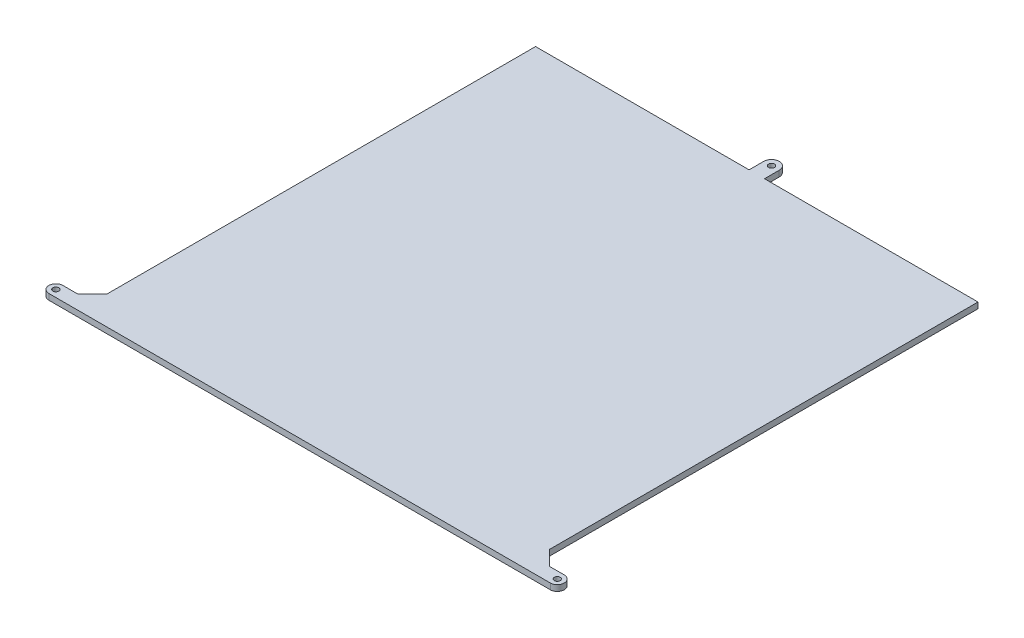
ISO-10303-21;
HEADER;
FILE_DESCRIPTION(('STEP AP214'),'2;1');
FILE_NAME('part.step','',(''),(''),'','','');
FILE_SCHEMA(('AUTOMOTIVE_DESIGN { 1 0 10303 214 1 1 1 1 }'));
ENDSEC;
DATA;
#1=APPLICATION_CONTEXT('core data for automotive mechanical design processes');
#2=APPLICATION_PROTOCOL_DEFINITION('international standard','automotive_design',2000,#1);
#3=PRODUCT_CONTEXT('',#1,'mechanical');
#4=PRODUCT('Part','Part','',(#3));
#5=PRODUCT_RELATED_PRODUCT_CATEGORY('part','',(#4));
#6=PRODUCT_DEFINITION_FORMATION('','',#4);
#7=PRODUCT_DEFINITION_CONTEXT('part definition',#1,'design');
#8=PRODUCT_DEFINITION('design','',#6,#7);
#9=PRODUCT_DEFINITION_SHAPE('','',#8);
#10=(LENGTH_UNIT() NAMED_UNIT(*) SI_UNIT(.MILLI.,.METRE.));
#11=(NAMED_UNIT(*) PLANE_ANGLE_UNIT() SI_UNIT($,.RADIAN.));
#12=(NAMED_UNIT(*) SI_UNIT($,.STERADIAN.) SOLID_ANGLE_UNIT());
#13=UNCERTAINTY_MEASURE_WITH_UNIT(LENGTH_MEASURE(1.E-05),#10,'distance_accuracy_value','');
#14=(GEOMETRIC_REPRESENTATION_CONTEXT(3) GLOBAL_UNCERTAINTY_ASSIGNED_CONTEXT((#13)) GLOBAL_UNIT_ASSIGNED_CONTEXT((#10,
#11,#12)) REPRESENTATION_CONTEXT('',''));
#15=CARTESIAN_POINT('',(0.,0.,0.));
#16=DIRECTION('',(0.,0.,1.));
#17=DIRECTION('',(1.,0.,0.));
#18=AXIS2_PLACEMENT_3D('',#15,#16,#17);
#19=CARTESIAN_POINT('',(0.,4.,-160.));
#20=DIRECTION('',(0.,-1.,0.));
#21=DIRECTION('',(0.,0.,-1.));
#22=AXIS2_PLACEMENT_3D('',#19,#20,#21);
#23=CYLINDRICAL_SURFACE('',#22,5.22079231391709);
#24=CARTESIAN_POINT('',(0.,0.,-160.));
#25=DIRECTION('',(0.,1.,0.));
#26=DIRECTION('',(0.,0.,1.));
#27=AXIS2_PLACEMENT_3D('',#24,#25,#26);
#28=CIRCLE('',#27,5.22079231391709);
#29=CARTESIAN_POINT('',(-5.22079231391714,0.,-160.));
#30=VERTEX_POINT('',#29);
#31=CARTESIAN_POINT('',(5.22079231391703,0.,-160.));
#32=VERTEX_POINT('',#31);
#33=EDGE_CURVE('E176',#30,#32,#28,.F.);
#34=ORIENTED_EDGE('',*,*,#33,.F.);
#35=DIRECTION('',(0.,-1.,0.));
#36=VECTOR('',#35,1.);
#37=CARTESIAN_POINT('',(-5.22079231391714,4.,-160.));
#38=LINE('',#37,#36);
#39=CARTESIAN_POINT('',(-5.22079231391714,4.,-160.));
#40=VERTEX_POINT('',#39);
#41=EDGE_CURVE('E11',#40,#30,#38,.T.);
#42=ORIENTED_EDGE('',*,*,#41,.F.);
#43=CARTESIAN_POINT('',(0.,4.,-160.));
#44=DIRECTION('',(0.,1.,0.));
#45=DIRECTION('',(0.,0.,1.));
#46=AXIS2_PLACEMENT_3D('',#43,#44,#45);
#47=CIRCLE('',#46,5.22079231391709);
#48=CARTESIAN_POINT('',(5.22079231391703,4.,-160.));
#49=VERTEX_POINT('',#48);
#50=EDGE_CURVE('E219',#40,#49,#47,.F.);
#51=ORIENTED_EDGE('',*,*,#50,.T.);
#52=DIRECTION('',(0.,-1.,0.));
#53=VECTOR('',#52,1.);
#54=CARTESIAN_POINT('',(5.22079231391703,4.,-160.));
#55=LINE('',#54,#53);
#56=EDGE_CURVE('E53',#49,#32,#55,.T.);
#57=ORIENTED_EDGE('',*,*,#56,.T.);
#58=EDGE_LOOP('',(#34,#42,#51,#57));
#59=FACE_BOUND('',#58,.T.);
#60=ADVANCED_FACE('F37',(#59),#23,.T.);
#61=CARTESIAN_POINT('',(-5.22079231391714,4.,0.));
#62=DIRECTION('',(1.,0.,0.));
#63=DIRECTION('',(0.,0.,-1.));
#64=AXIS2_PLACEMENT_3D('',#61,#62,#63);
#65=PLANE('',#64);
#66=DIRECTION('',(0.,0.,1.));
#67=VECTOR('',#66,1.);
#68=CARTESIAN_POINT('',(-5.22079231391714,0.,0.));
#69=LINE('',#68,#67);
#70=CARTESIAN_POINT('',(-5.22079231391714,0.,-150.));
#71=VERTEX_POINT('',#70);
#72=EDGE_CURVE('E178',#30,#71,#69,.T.);
#73=ORIENTED_EDGE('',*,*,#72,.T.);
#74=DIRECTION('',(0.,-1.,0.));
#75=VECTOR('',#74,1.);
#76=CARTESIAN_POINT('',(-5.22079231391714,4.,-150.));
#77=LINE('',#76,#75);
#78=CARTESIAN_POINT('',(-5.22079231391714,4.,-150.));
#79=VERTEX_POINT('',#78);
#80=EDGE_CURVE('E45',#79,#71,#77,.T.);
#81=ORIENTED_EDGE('',*,*,#80,.F.);
#82=DIRECTION('',(0.,0.,1.));
#83=VECTOR('',#82,1.);
#84=CARTESIAN_POINT('',(-5.22079231391714,4.,0.));
#85=LINE('',#84,#83);
#86=EDGE_CURVE('E266',#40,#79,#85,.T.);
#87=ORIENTED_EDGE('',*,*,#86,.F.);
#88=ORIENTED_EDGE('',*,*,#41,.T.);
#89=EDGE_LOOP('',(#73,#81,#87,#88));
#90=FACE_BOUND('',#89,.T.);
#91=ADVANCED_FACE('F251',(#90),#65,.F.);
#92=CARTESIAN_POINT('',(0.,4.,-150.));
#93=DIRECTION('',(0.,0.,-1.));
#94=DIRECTION('',(-1.,0.,0.));
#95=AXIS2_PLACEMENT_3D('',#92,#93,#94);
#96=PLANE('',#95);
#97=DIRECTION('',(1.,0.,0.));
#98=VECTOR('',#97,1.);
#99=CARTESIAN_POINT('',(0.,0.,-150.));
#100=LINE('',#99,#98);
#101=CARTESIAN_POINT('',(-150.,0.,-150.));
#102=VERTEX_POINT('',#101);
#103=EDGE_CURVE('E181',#102,#71,#100,.T.);
#104=ORIENTED_EDGE('',*,*,#103,.F.);
#105=DIRECTION('',(0.,-1.,0.));
#106=VECTOR('',#105,1.);
#107=CARTESIAN_POINT('',(-150.,4.,-150.));
#108=LINE('',#107,#106);
#109=CARTESIAN_POINT('',(-150.,4.,-150.));
#110=VERTEX_POINT('',#109);
#111=EDGE_CURVE('E241',#110,#102,#108,.T.);
#112=ORIENTED_EDGE('',*,*,#111,.F.);
#113=DIRECTION('',(1.,0.,0.));
#114=VECTOR('',#113,1.);
#115=CARTESIAN_POINT('',(0.,4.,-150.));
#116=LINE('',#115,#114);
#117=EDGE_CURVE('E248',#110,#79,#116,.T.);
#118=ORIENTED_EDGE('',*,*,#117,.T.);
#119=ORIENTED_EDGE('',*,*,#80,.T.);
#120=EDGE_LOOP('',(#104,#112,#118,#119));
#121=FACE_BOUND('',#120,.T.);
#122=ADVANCED_FACE('F246',(#121),#96,.T.);
#123=CARTESIAN_POINT('',(-150.,4.,0.));
#124=DIRECTION('',(1.,0.,0.));
#125=DIRECTION('',(0.,0.,-1.));
#126=AXIS2_PLACEMENT_3D('',#123,#124,#125);
#127=PLANE('',#126);
#128=DIRECTION('',(0.,0.,1.));
#129=VECTOR('',#128,1.);
#130=CARTESIAN_POINT('',(-150.,0.,0.));
#131=LINE('',#130,#129);
#132=CARTESIAN_POINT('',(-150.,0.,140.527151097649));
#133=VERTEX_POINT('',#132);
#134=EDGE_CURVE('E184',#102,#133,#131,.T.);
#135=ORIENTED_EDGE('',*,*,#134,.T.);
#136=DIRECTION('',(0.,-1.,0.));
#137=VECTOR('',#136,1.);
#138=CARTESIAN_POINT('',(-150.,4.,140.527151097649));
#139=LINE('',#138,#137);
#140=CARTESIAN_POINT('',(-150.,4.,140.527151097649));
#141=VERTEX_POINT('',#140);
#142=EDGE_CURVE('E239',#141,#133,#139,.T.);
#143=ORIENTED_EDGE('',*,*,#142,.F.);
#144=DIRECTION('',(0.,0.,1.));
#145=VECTOR('',#144,1.);
#146=CARTESIAN_POINT('',(-150.,4.,0.));
#147=LINE('',#146,#145);
#148=EDGE_CURVE('E262',#110,#141,#147,.T.);
#149=ORIENTED_EDGE('',*,*,#148,.F.);
#150=ORIENTED_EDGE('',*,*,#111,.T.);
#151=EDGE_LOOP('',(#135,#143,#149,#150));
#152=FACE_BOUND('',#151,.T.);
#153=ADVANCED_FACE('F259',(#152),#127,.F.);
#154=CARTESIAN_POINT('',(-4.73642445117548,4.,-4.73642445117548));
#155=DIRECTION('',(-0.707106781186547,0.,-0.707106781186547));
#156=DIRECTION('',(-0.707106781186548,0.,0.707106781186548));
#157=AXIS2_PLACEMENT_3D('',#154,#155,#156);
#158=PLANE('',#157);
#159=DIRECTION('',(0.707106781186548,0.,-0.707106781186548));
#160=VECTOR('',#159,1.);
#161=CARTESIAN_POINT('',(-4.73642445117548,0.,-4.73642445117548));
#162=LINE('',#161,#160);
#163=CARTESIAN_POINT('',(-160.,0.,150.527151097649));
#164=VERTEX_POINT('',#163);
#165=EDGE_CURVE('E187',#164,#133,#162,.T.);
#166=ORIENTED_EDGE('',*,*,#165,.F.);
#167=DIRECTION('',(0.,-1.,0.));
#168=VECTOR('',#167,1.);
#169=CARTESIAN_POINT('',(-160.,4.,150.527151097649));
#170=LINE('',#169,#168);
#171=CARTESIAN_POINT('',(-160.,4.,150.527151097649));
#172=VERTEX_POINT('',#171);
#173=EDGE_CURVE('E237',#172,#164,#170,.T.);
#174=ORIENTED_EDGE('',*,*,#173,.F.);
#175=DIRECTION('',(0.707106781186548,0.,-0.707106781186548));
#176=VECTOR('',#175,1.);
#177=CARTESIAN_POINT('',(-4.73642445117548,4.,-4.73642445117548));
#178=LINE('',#177,#176);
#179=EDGE_CURVE('E264',#172,#141,#178,.T.);
#180=ORIENTED_EDGE('',*,*,#179,.T.);
#181=ORIENTED_EDGE('',*,*,#142,.T.);
#182=EDGE_LOOP('',(#166,#174,#180,#181));
#183=FACE_BOUND('',#182,.T.);
#184=ADVANCED_FACE('F318',(#183),#158,.T.);
#185=CARTESIAN_POINT('',(0.,4.,150.527151097649));
#186=DIRECTION('',(0.,0.,-1.));
#187=DIRECTION('',(-1.,0.,0.));
#188=AXIS2_PLACEMENT_3D('',#185,#186,#187);
#189=PLANE('',#188);
#190=DIRECTION('',(1.,0.,0.));
#191=VECTOR('',#190,1.);
#192=CARTESIAN_POINT('',(0.,0.,150.527151097649));
#193=LINE('',#192,#191);
#194=CARTESIAN_POINT('',(-170.,0.,150.527151097649));
#195=VERTEX_POINT('',#194);
#196=EDGE_CURVE('E190',#195,#164,#193,.T.);
#197=ORIENTED_EDGE('',*,*,#196,.F.);
#198=DIRECTION('',(0.,-1.,0.));
#199=VECTOR('',#198,1.);
#200=CARTESIAN_POINT('',(-170.,4.,150.527151097649));
#201=LINE('',#200,#199);
#202=CARTESIAN_POINT('',(-170.,4.,150.527151097649));
#203=VERTEX_POINT('',#202);
#204=EDGE_CURVE('E235',#203,#195,#201,.T.);
#205=ORIENTED_EDGE('',*,*,#204,.F.);
#206=DIRECTION('',(1.,0.,0.));
#207=VECTOR('',#206,1.);
#208=CARTESIAN_POINT('',(0.,4.,150.527151097649));
#209=LINE('',#208,#207);
#210=EDGE_CURVE('E272',#203,#172,#209,.T.);
#211=ORIENTED_EDGE('',*,*,#210,.T.);
#212=ORIENTED_EDGE('',*,*,#173,.T.);
#213=EDGE_LOOP('',(#197,#205,#211,#212));
#214=FACE_BOUND('',#213,.T.);
#215=ADVANCED_FACE('F321',(#214),#189,.T.);
#216=CARTESIAN_POINT('',(-170.,4.,155.263575548825));
#217=DIRECTION('',(0.,-1.,0.));
#218=DIRECTION('',(0.,0.,-1.));
#219=AXIS2_PLACEMENT_3D('',#216,#217,#218);
#220=CYLINDRICAL_SURFACE('',#219,4.73642445117553);
#221=CARTESIAN_POINT('',(-170.,0.,155.263575548825));
#222=DIRECTION('',(0.,1.,0.));
#223=DIRECTION('',(0.,0.,1.));
#224=AXIS2_PLACEMENT_3D('',#221,#222,#223);
#225=CIRCLE('',#224,4.73642445117553);
#226=CARTESIAN_POINT('',(-170.,0.,160.));
#227=VERTEX_POINT('',#226);
#228=EDGE_CURVE('E193',#195,#227,#225,.T.);
#229=ORIENTED_EDGE('',*,*,#228,.T.);
#230=DIRECTION('',(0.,-1.,0.));
#231=VECTOR('',#230,1.);
#232=CARTESIAN_POINT('',(-170.,4.,160.));
#233=LINE('',#232,#231);
#234=CARTESIAN_POINT('',(-170.,4.,160.));
#235=VERTEX_POINT('',#234);
#236=EDGE_CURVE('E232',#235,#227,#233,.T.);
#237=ORIENTED_EDGE('',*,*,#236,.F.);
#238=CARTESIAN_POINT('',(-170.,4.,155.263575548825));
#239=DIRECTION('',(0.,1.,0.));
#240=DIRECTION('',(0.,0.,1.));
#241=AXIS2_PLACEMENT_3D('',#238,#239,#240);
#242=CIRCLE('',#241,4.73642445117553);
#243=EDGE_CURVE('E275',#203,#235,#242,.T.);
#244=ORIENTED_EDGE('',*,*,#243,.F.);
#245=ORIENTED_EDGE('',*,*,#204,.T.);
#246=EDGE_LOOP('',(#229,#237,#244,#245));
#247=FACE_BOUND('',#246,.T.);
#248=ADVANCED_FACE('F325',(#247),#220,.T.);
#249=CARTESIAN_POINT('',(0.,4.,160.));
#250=DIRECTION('',(0.,0.,-1.));
#251=DIRECTION('',(-1.,0.,0.));
#252=AXIS2_PLACEMENT_3D('',#249,#250,#251);
#253=PLANE('',#252);
#254=DIRECTION('',(1.,0.,0.));
#255=VECTOR('',#254,1.);
#256=CARTESIAN_POINT('',(0.,0.,160.));
#257=LINE('',#256,#255);
#258=CARTESIAN_POINT('',(170.,0.,160.));
#259=VERTEX_POINT('',#258);
#260=EDGE_CURVE('E195',#227,#259,#257,.T.);
#261=ORIENTED_EDGE('',*,*,#260,.T.);
#262=DIRECTION('',(0.,-1.,0.));
#263=VECTOR('',#262,1.);
#264=CARTESIAN_POINT('',(170.,4.,160.));
#265=LINE('',#264,#263);
#266=CARTESIAN_POINT('',(170.,4.,160.));
#267=VERTEX_POINT('',#266);
#268=EDGE_CURVE('E229',#267,#259,#265,.T.);
#269=ORIENTED_EDGE('',*,*,#268,.F.);
#270=DIRECTION('',(1.,0.,0.));
#271=VECTOR('',#270,1.);
#272=CARTESIAN_POINT('',(0.,4.,160.));
#273=LINE('',#272,#271);
#274=EDGE_CURVE('E277',#235,#267,#273,.T.);
#275=ORIENTED_EDGE('',*,*,#274,.F.);
#276=ORIENTED_EDGE('',*,*,#236,.T.);
#277=EDGE_LOOP('',(#261,#269,#275,#276));
#278=FACE_BOUND('',#277,.T.);
#279=ADVANCED_FACE('F329',(#278),#253,.F.);
#280=CARTESIAN_POINT('',(170.,4.,155.263575548825));
#281=DIRECTION('',(0.,-1.,0.));
#282=DIRECTION('',(0.,0.,-1.));
#283=AXIS2_PLACEMENT_3D('',#280,#281,#282);
#284=CYLINDRICAL_SURFACE('',#283,4.73642445117554);
#285=CARTESIAN_POINT('',(170.,0.,155.263575548825));
#286=DIRECTION('',(0.,1.,0.));
#287=DIRECTION('',(0.,0.,1.));
#288=AXIS2_PLACEMENT_3D('',#285,#286,#287);
#289=CIRCLE('',#288,4.73642445117554);
#290=CARTESIAN_POINT('',(170.,0.,150.527151097649));
#291=VERTEX_POINT('',#290);
#292=EDGE_CURVE('E197',#259,#291,#289,.T.);
#293=ORIENTED_EDGE('',*,*,#292,.T.);
#294=DIRECTION('',(0.,-1.,0.));
#295=VECTOR('',#294,1.);
#296=CARTESIAN_POINT('',(170.,4.,150.527151097649));
#297=LINE('',#296,#295);
#298=CARTESIAN_POINT('',(170.,4.,150.527151097649));
#299=VERTEX_POINT('',#298);
#300=EDGE_CURVE('E226',#299,#291,#297,.T.);
#301=ORIENTED_EDGE('',*,*,#300,.F.);
#302=CARTESIAN_POINT('',(170.,4.,155.263575548825));
#303=DIRECTION('',(0.,1.,0.));
#304=DIRECTION('',(0.,0.,1.));
#305=AXIS2_PLACEMENT_3D('',#302,#303,#304);
#306=CIRCLE('',#305,4.73642445117554);
#307=EDGE_CURVE('E279',#267,#299,#306,.T.);
#308=ORIENTED_EDGE('',*,*,#307,.F.);
#309=ORIENTED_EDGE('',*,*,#268,.T.);
#310=EDGE_LOOP('',(#293,#301,#308,#309));
#311=FACE_BOUND('',#310,.T.);
#312=ADVANCED_FACE('F333',(#311),#284,.T.);
#313=CARTESIAN_POINT('',(4.177967724496E-13,4.,150.527151097649));
#314=DIRECTION('',(0.,0.,1.));
#315=DIRECTION('',(1.,0.,0.));
#316=AXIS2_PLACEMENT_3D('',#313,#314,#315);
#317=PLANE('',#316);
#318=DIRECTION('',(-1.,0.,0.));
#319=VECTOR('',#318,1.);
#320=CARTESIAN_POINT('',(4.177967724496E-13,0.,150.527151097649));
#321=LINE('',#320,#319);
#322=CARTESIAN_POINT('',(160.,0.,150.527151097649));
#323=VERTEX_POINT('',#322);
#324=EDGE_CURVE('E199',#291,#323,#321,.T.);
#325=ORIENTED_EDGE('',*,*,#324,.T.);
#326=DIRECTION('',(0.,-1.,0.));
#327=VECTOR('',#326,1.);
#328=CARTESIAN_POINT('',(160.,4.,150.527151097649));
#329=LINE('',#328,#327);
#330=CARTESIAN_POINT('',(160.,4.,150.527151097649));
#331=VERTEX_POINT('',#330);
#332=EDGE_CURVE('E223',#331,#323,#329,.T.);
#333=ORIENTED_EDGE('',*,*,#332,.F.);
#334=DIRECTION('',(-1.,0.,0.));
#335=VECTOR('',#334,1.);
#336=CARTESIAN_POINT('',(4.177967724496E-13,4.,150.527151097649));
#337=LINE('',#336,#335);
#338=EDGE_CURVE('E281',#299,#331,#337,.T.);
#339=ORIENTED_EDGE('',*,*,#338,.F.);
#340=ORIENTED_EDGE('',*,*,#300,.T.);
#341=EDGE_LOOP('',(#325,#333,#339,#340));
#342=FACE_BOUND('',#341,.T.);
#343=ADVANCED_FACE('F287',(#342),#317,.F.);
#344=CARTESIAN_POINT('',(4.73642445117548,4.,-4.73642445117548));
#345=DIRECTION('',(-0.707106781186547,0.,0.707106781186547));
#346=DIRECTION('',(0.707106781186548,0.,0.707106781186548));
#347=AXIS2_PLACEMENT_3D('',#344,#345,#346);
#348=PLANE('',#347);
#349=DIRECTION('',(-0.707106781186548,0.,-0.707106781186548));
#350=VECTOR('',#349,1.);
#351=CARTESIAN_POINT('',(4.73642445117548,0.,-4.73642445117548));
#352=LINE('',#351,#350);
#353=CARTESIAN_POINT('',(150.,0.,140.527151097649));
#354=VERTEX_POINT('',#353);
#355=EDGE_CURVE('E201',#323,#354,#352,.T.);
#356=ORIENTED_EDGE('',*,*,#355,.T.);
#357=DIRECTION('',(0.,-1.,0.));
#358=VECTOR('',#357,1.);
#359=CARTESIAN_POINT('',(150.,4.,140.527151097649));
#360=LINE('',#359,#358);
#361=CARTESIAN_POINT('',(150.,4.,140.527151097649));
#362=VERTEX_POINT('',#361);
#363=EDGE_CURVE('E148',#362,#354,#360,.T.);
#364=ORIENTED_EDGE('',*,*,#363,.F.);
#365=DIRECTION('',(-0.707106781186548,0.,-0.707106781186548));
#366=VECTOR('',#365,1.);
#367=CARTESIAN_POINT('',(4.73642445117548,4.,-4.73642445117548));
#368=LINE('',#367,#366);
#369=EDGE_CURVE('E158',#331,#362,#368,.T.);
#370=ORIENTED_EDGE('',*,*,#369,.F.);
#371=ORIENTED_EDGE('',*,*,#332,.T.);
#372=EDGE_LOOP('',(#356,#364,#370,#371));
#373=FACE_BOUND('',#372,.T.);
#374=ADVANCED_FACE('F291',(#373),#348,.F.);
#375=CARTESIAN_POINT('',(150.,4.,0.));
#376=DIRECTION('',(1.,0.,0.));
#377=DIRECTION('',(0.,0.,-1.));
#378=AXIS2_PLACEMENT_3D('',#375,#376,#377);
#379=PLANE('',#378);
#380=DIRECTION('',(0.,0.,1.));
#381=VECTOR('',#380,1.);
#382=CARTESIAN_POINT('',(150.,0.,0.));
#383=LINE('',#382,#381);
#384=CARTESIAN_POINT('',(150.,0.,-150.));
#385=VERTEX_POINT('',#384);
#386=EDGE_CURVE('E144',#385,#354,#383,.T.);
#387=ORIENTED_EDGE('',*,*,#386,.F.);
#388=DIRECTION('',(0.,-1.,0.));
#389=VECTOR('',#388,1.);
#390=CARTESIAN_POINT('',(150.,4.,-150.));
#391=LINE('',#390,#389);
#392=CARTESIAN_POINT('',(150.,4.,-150.));
#393=VERTEX_POINT('',#392);
#394=EDGE_CURVE('E139',#393,#385,#391,.T.);
#395=ORIENTED_EDGE('',*,*,#394,.F.);
#396=DIRECTION('',(0.,0.,1.));
#397=VECTOR('',#396,1.);
#398=CARTESIAN_POINT('',(150.,4.,0.));
#399=LINE('',#398,#397);
#400=EDGE_CURVE('E142',#393,#362,#399,.T.);
#401=ORIENTED_EDGE('',*,*,#400,.T.);
#402=ORIENTED_EDGE('',*,*,#363,.T.);
#403=EDGE_LOOP('',(#387,#395,#401,#402));
#404=FACE_BOUND('',#403,.T.);
#405=ADVANCED_FACE('F141',(#404),#379,.T.);
#406=CARTESIAN_POINT('',(0.,4.,-150.));
#407=DIRECTION('',(0.,0.,-1.));
#408=DIRECTION('',(-1.,0.,0.));
#409=AXIS2_PLACEMENT_3D('',#406,#407,#408);
#410=PLANE('',#409);
#411=DIRECTION('',(1.,0.,0.));
#412=VECTOR('',#411,1.);
#413=CARTESIAN_POINT('',(0.,0.,-150.));
#414=LINE('',#413,#412);
#415=CARTESIAN_POINT('',(5.22079231391703,0.,-150.));
#416=VERTEX_POINT('',#415);
#417=EDGE_CURVE('E205',#416,#385,#414,.T.);
#418=ORIENTED_EDGE('',*,*,#417,.F.);
#419=DIRECTION('',(0.,-1.,0.));
#420=VECTOR('',#419,1.);
#421=CARTESIAN_POINT('',(5.22079231391703,4.,-150.));
#422=LINE('',#421,#420);
#423=CARTESIAN_POINT('',(5.22079231391703,4.,-150.));
#424=VERTEX_POINT('',#423);
#425=EDGE_CURVE('E96',#424,#416,#422,.T.);
#426=ORIENTED_EDGE('',*,*,#425,.F.);
#427=DIRECTION('',(1.,0.,0.));
#428=VECTOR('',#427,1.);
#429=CARTESIAN_POINT('',(0.,4.,-150.));
#430=LINE('',#429,#428);
#431=EDGE_CURVE('E156',#424,#393,#430,.T.);
#432=ORIENTED_EDGE('',*,*,#431,.T.);
#433=ORIENTED_EDGE('',*,*,#394,.T.);
#434=EDGE_LOOP('',(#418,#426,#432,#433));
#435=FACE_BOUND('',#434,.T.);
#436=ADVANCED_FACE('F161',(#435),#410,.T.);
#437=CARTESIAN_POINT('',(-170.,4.,155.263575548825));
#438=DIRECTION('',(0.,-1.,0.));
#439=DIRECTION('',(0.,0.,-1.));
#440=AXIS2_PLACEMENT_3D('',#437,#438,#439);
#441=CYLINDRICAL_SURFACE('',#440,2.);
#442=CARTESIAN_POINT('',(-170.,4.,155.263575548825));
#443=DIRECTION('',(0.,1.,0.));
#444=DIRECTION('',(0.,0.,1.));
#445=AXIS2_PLACEMENT_3D('',#442,#443,#444);
#446=CIRCLE('',#445,2.);
#447=CARTESIAN_POINT('',(-170.,4.,157.263575548825));
#448=VERTEX_POINT('',#447);
#449=EDGE_CURVE('E170',#448,#448,#446,.T.);
#450=ORIENTED_EDGE('',*,*,#449,.T.);
#451=EDGE_LOOP('',(#450));
#452=FACE_BOUND('',#451,.T.);
#453=CARTESIAN_POINT('',(-170.,0.,155.263575548825));
#454=DIRECTION('',(0.,1.,0.));
#455=DIRECTION('',(0.,0.,1.));
#456=AXIS2_PLACEMENT_3D('',#453,#454,#455);
#457=CIRCLE('',#456,2.);
#458=CARTESIAN_POINT('',(-170.,0.,157.263575548825));
#459=VERTEX_POINT('',#458);
#460=EDGE_CURVE('E213',#459,#459,#457,.T.);
#461=ORIENTED_EDGE('',*,*,#460,.F.);
#462=EDGE_LOOP('',(#461));
#463=FACE_BOUND('',#462,.T.);
#464=ADVANCED_FACE('F303',(#452,#463),#441,.F.);
#465=CARTESIAN_POINT('',(170.,4.,155.263575548825));
#466=DIRECTION('',(0.,-1.,0.));
#467=DIRECTION('',(0.,0.,-1.));
#468=AXIS2_PLACEMENT_3D('',#465,#466,#467);
#469=CYLINDRICAL_SURFACE('',#468,2.);
#470=CARTESIAN_POINT('',(170.,4.,155.263575548825));
#471=DIRECTION('',(0.,1.,0.));
#472=DIRECTION('',(0.,0.,1.));
#473=AXIS2_PLACEMENT_3D('',#470,#471,#472);
#474=CIRCLE('',#473,2.);
#475=CARTESIAN_POINT('',(170.,4.,157.263575548825));
#476=VERTEX_POINT('',#475);
#477=EDGE_CURVE('E164',#476,#476,#474,.T.);
#478=ORIENTED_EDGE('',*,*,#477,.T.);
#479=EDGE_LOOP('',(#478));
#480=FACE_BOUND('',#479,.T.);
#481=CARTESIAN_POINT('',(170.,0.,155.263575548825));
#482=DIRECTION('',(0.,1.,0.));
#483=DIRECTION('',(0.,0.,1.));
#484=AXIS2_PLACEMENT_3D('',#481,#482,#483);
#485=CIRCLE('',#484,2.);
#486=CARTESIAN_POINT('',(170.,0.,157.263575548825));
#487=VERTEX_POINT('',#486);
#488=EDGE_CURVE('E210',#487,#487,#485,.T.);
#489=ORIENTED_EDGE('',*,*,#488,.F.);
#490=EDGE_LOOP('',(#489));
#491=FACE_BOUND('',#490,.T.);
#492=ADVANCED_FACE('F295',(#480,#491),#469,.F.);
#493=CARTESIAN_POINT('',(5.22079231391703,4.,0.));
#494=DIRECTION('',(1.,0.,0.));
#495=DIRECTION('',(0.,0.,-1.));
#496=AXIS2_PLACEMENT_3D('',#493,#494,#495);
#497=PLANE('',#496);
#498=DIRECTION('',(0.,0.,1.));
#499=VECTOR('',#498,1.);
#500=CARTESIAN_POINT('',(5.22079231391703,0.,0.));
#501=LINE('',#500,#499);
#502=EDGE_CURVE('E207',#32,#416,#501,.T.);
#503=ORIENTED_EDGE('',*,*,#502,.F.);
#504=ORIENTED_EDGE('',*,*,#56,.F.);
#505=DIRECTION('',(0.,0.,1.));
#506=VECTOR('',#505,1.);
#507=CARTESIAN_POINT('',(5.22079231391703,4.,0.));
#508=LINE('',#507,#506);
#509=EDGE_CURVE('E162',#49,#424,#508,.T.);
#510=ORIENTED_EDGE('',*,*,#509,.T.);
#511=ORIENTED_EDGE('',*,*,#425,.T.);
#512=EDGE_LOOP('',(#503,#504,#510,#511));
#513=FACE_BOUND('',#512,.T.);
#514=ADVANCED_FACE('F292',(#513),#497,.T.);
#515=CARTESIAN_POINT('',(0.,4.,-160.));
#516=DIRECTION('',(0.,-1.,0.));
#517=DIRECTION('',(0.,0.,-1.));
#518=AXIS2_PLACEMENT_3D('',#515,#516,#517);
#519=CYLINDRICAL_SURFACE('',#518,2.);
#520=CARTESIAN_POINT('',(0.,4.,-160.));
#521=DIRECTION('',(0.,1.,0.));
#522=DIRECTION('',(0.,0.,1.));
#523=AXIS2_PLACEMENT_3D('',#520,#521,#522);
#524=CIRCLE('',#523,2.);
#525=CARTESIAN_POINT('',(0.,4.,-158.));
#526=VERTEX_POINT('',#525);
#527=EDGE_CURVE('E173',#526,#526,#524,.T.);
#528=ORIENTED_EDGE('',*,*,#527,.T.);
#529=EDGE_LOOP('',(#528));
#530=FACE_BOUND('',#529,.T.);
#531=CARTESIAN_POINT('',(0.,0.,-160.));
#532=DIRECTION('',(0.,1.,0.));
#533=DIRECTION('',(0.,0.,1.));
#534=AXIS2_PLACEMENT_3D('',#531,#532,#533);
#535=CIRCLE('',#534,2.);
#536=CARTESIAN_POINT('',(0.,0.,-158.));
#537=VERTEX_POINT('',#536);
#538=EDGE_CURVE('E216',#537,#537,#535,.T.);
#539=ORIENTED_EDGE('',*,*,#538,.F.);
#540=EDGE_LOOP('',(#539));
#541=FACE_BOUND('',#540,.T.);
#542=ADVANCED_FACE('F294',(#530,#541),#519,.F.);
#543=CARTESIAN_POINT('',(0.,4.,0.));
#544=DIRECTION('',(0.,1.,0.));
#545=DIRECTION('',(0.,0.,1.));
#546=AXIS2_PLACEMENT_3D('',#543,#544,#545);
#547=PLANE('',#546);
#548=ORIENTED_EDGE('',*,*,#50,.F.);
#549=ORIENTED_EDGE('',*,*,#86,.T.);
#550=ORIENTED_EDGE('',*,*,#117,.F.);
#551=ORIENTED_EDGE('',*,*,#148,.T.);
#552=ORIENTED_EDGE('',*,*,#179,.F.);
#553=ORIENTED_EDGE('',*,*,#210,.F.);
#554=ORIENTED_EDGE('',*,*,#243,.T.);
#555=ORIENTED_EDGE('',*,*,#274,.T.);
#556=ORIENTED_EDGE('',*,*,#307,.T.);
#557=ORIENTED_EDGE('',*,*,#338,.T.);
#558=ORIENTED_EDGE('',*,*,#369,.T.);
#559=ORIENTED_EDGE('',*,*,#400,.F.);
#560=ORIENTED_EDGE('',*,*,#431,.F.);
#561=ORIENTED_EDGE('',*,*,#509,.F.);
#562=EDGE_LOOP('',(#548,#549,#550,#551,#552,#553,#554,#555,#556,#557,#558,#559,#560,#561));
#563=FACE_BOUND('',#562,.T.);
#564=ORIENTED_EDGE('',*,*,#477,.F.);
#565=EDGE_LOOP('',(#564));
#566=FACE_BOUND('',#565,.T.);
#567=ORIENTED_EDGE('',*,*,#449,.F.);
#568=EDGE_LOOP('',(#567));
#569=FACE_BOUND('',#568,.T.);
#570=ORIENTED_EDGE('',*,*,#527,.F.);
#571=EDGE_LOOP('',(#570));
#572=FACE_BOUND('',#571,.T.);
#573=ADVANCED_FACE('F153',(#563,#566,#569,#572),#547,.T.);
#574=CARTESIAN_POINT('',(0.,0.,0.));
#575=DIRECTION('',(0.,1.,0.));
#576=DIRECTION('',(0.,0.,1.));
#577=AXIS2_PLACEMENT_3D('',#574,#575,#576);
#578=PLANE('',#577);
#579=ORIENTED_EDGE('',*,*,#33,.T.);
#580=ORIENTED_EDGE('',*,*,#502,.T.);
#581=ORIENTED_EDGE('',*,*,#417,.T.);
#582=ORIENTED_EDGE('',*,*,#386,.T.);
#583=ORIENTED_EDGE('',*,*,#355,.F.);
#584=ORIENTED_EDGE('',*,*,#324,.F.);
#585=ORIENTED_EDGE('',*,*,#292,.F.);
#586=ORIENTED_EDGE('',*,*,#260,.F.);
#587=ORIENTED_EDGE('',*,*,#228,.F.);
#588=ORIENTED_EDGE('',*,*,#196,.T.);
#589=ORIENTED_EDGE('',*,*,#165,.T.);
#590=ORIENTED_EDGE('',*,*,#134,.F.);
#591=ORIENTED_EDGE('',*,*,#103,.T.);
#592=ORIENTED_EDGE('',*,*,#72,.F.);
#593=EDGE_LOOP('',(#579,#580,#581,#582,#583,#584,#585,#586,#587,#588,#589,#590,#591,#592));
#594=FACE_BOUND('',#593,.T.);
#595=ORIENTED_EDGE('',*,*,#488,.T.);
#596=EDGE_LOOP('',(#595));
#597=FACE_BOUND('',#596,.T.);
#598=ORIENTED_EDGE('',*,*,#460,.T.);
#599=EDGE_LOOP('',(#598));
#600=FACE_BOUND('',#599,.T.);
#601=ORIENTED_EDGE('',*,*,#538,.T.);
#602=EDGE_LOOP('',(#601));
#603=FACE_BOUND('',#602,.T.);
#604=ADVANCED_FACE('F254',(#594,#597,#600,#603),#578,.F.);
#605=CLOSED_SHELL('',(#60,#91,#122,#153,#184,#215,#248,#279,#312,#343,#374,#405,#436,#464,#492,
#514,#542,#573,#604));
#606=MANIFOLD_SOLID_BREP('B2',#605);
#607=ADVANCED_BREP_SHAPE_REPRESENTATION('',(#18,#606),#14);
#608=SHAPE_DEFINITION_REPRESENTATION(#9,#607);
ENDSEC;
END-ISO-10303-21;
